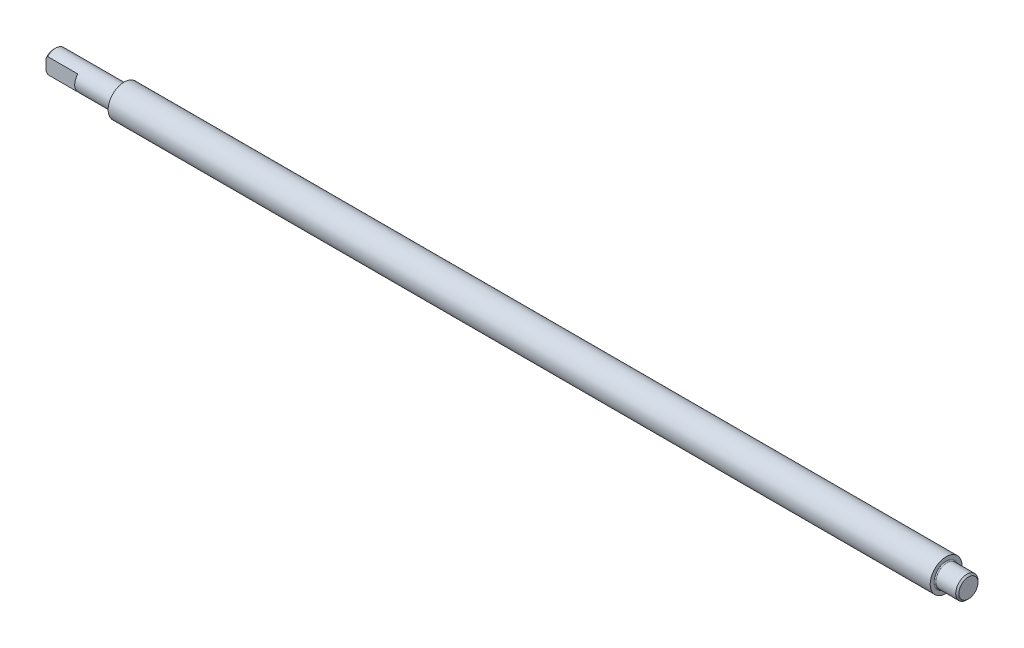
ISO-10303-21;
HEADER;
FILE_DESCRIPTION(('STEP AP214'),'2;1');
FILE_NAME('part.step','',(''),(''),'','','');
FILE_SCHEMA(('AUTOMOTIVE_DESIGN { 1 0 10303 214 1 1 1 1 }'));
ENDSEC;
DATA;
#1=APPLICATION_CONTEXT('core data for automotive mechanical design processes');
#2=APPLICATION_PROTOCOL_DEFINITION('international standard','automotive_design',2000,#1);
#3=PRODUCT_CONTEXT('',#1,'mechanical');
#4=PRODUCT('Part','Part','',(#3));
#5=PRODUCT_RELATED_PRODUCT_CATEGORY('part','',(#4));
#6=PRODUCT_DEFINITION_FORMATION('','',#4);
#7=PRODUCT_DEFINITION_CONTEXT('part definition',#1,'design');
#8=PRODUCT_DEFINITION('design','',#6,#7);
#9=PRODUCT_DEFINITION_SHAPE('','',#8);
#10=(LENGTH_UNIT() NAMED_UNIT(*) SI_UNIT(.MILLI.,.METRE.));
#11=(NAMED_UNIT(*) PLANE_ANGLE_UNIT() SI_UNIT($,.RADIAN.));
#12=(NAMED_UNIT(*) SI_UNIT($,.STERADIAN.) SOLID_ANGLE_UNIT());
#13=UNCERTAINTY_MEASURE_WITH_UNIT(LENGTH_MEASURE(1.E-05),#10,'distance_accuracy_value','');
#14=(GEOMETRIC_REPRESENTATION_CONTEXT(3) GLOBAL_UNCERTAINTY_ASSIGNED_CONTEXT((#13)) GLOBAL_UNIT_ASSIGNED_CONTEXT((#10,
#11,#12)) REPRESENTATION_CONTEXT('',''));
#15=CARTESIAN_POINT('',(0.,0.,0.));
#16=DIRECTION('',(0.,0.,1.));
#17=DIRECTION('',(1.,0.,0.));
#18=AXIS2_PLACEMENT_3D('',#15,#16,#17);
#19=CARTESIAN_POINT('',(287.,1.5,0.));
#20=DIRECTION('',(1.,0.,0.));
#21=DIRECTION('',(0.,0.,-1.));
#22=AXIS2_PLACEMENT_3D('',#19,#20,#21);
#23=PLANE('',#22);
#24=CARTESIAN_POINT('',(286.999999999921,0.,0.));
#25=DIRECTION('',(-1.,0.,0.));
#26=DIRECTION('',(0.,0.,1.));
#27=AXIS2_PLACEMENT_3D('',#24,#25,#26);
#28=CIRCLE('',#27,2.9999999999859);
#29=CARTESIAN_POINT('',(286.999999999921,0.,2.9999999999859));
#30=VERTEX_POINT('',#29);
#31=EDGE_CURVE('E167',#30,#30,#28,.T.);
#32=ORIENTED_EDGE('',*,*,#31,.F.);
#33=EDGE_LOOP('',(#32));
#34=FACE_BOUND('',#33,.T.);
#35=ADVANCED_FACE('F16',(#34),#23,.T.);
#36=CARTESIAN_POINT('',(0.,1.5,0.));
#37=DIRECTION('',(-1.,0.,0.));
#38=DIRECTION('',(0.,0.,1.));
#39=AXIS2_PLACEMENT_3D('',#36,#37,#38);
#40=PLANE('',#39);
#41=DIRECTION('',(0.,1.,0.));
#42=VECTOR('',#41,1.);
#43=CARTESIAN_POINT('',(0.,5.,2.5));
#44=LINE('',#43,#42);
#45=CARTESIAN_POINT('',(0.,-1.6583123951522,2.5));
#46=VERTEX_POINT('',#45);
#47=CARTESIAN_POINT('',(0.,1.6583123951522,2.5));
#48=VERTEX_POINT('',#47);
#49=EDGE_CURVE('E90',#46,#48,#44,.T.);
#50=ORIENTED_EDGE('',*,*,#49,.T.);
#51=CARTESIAN_POINT('',(0.,0.,0.));
#52=DIRECTION('',(1.,0.,0.));
#53=DIRECTION('',(0.,0.,-1.));
#54=AXIS2_PLACEMENT_3D('',#51,#52,#53);
#55=CIRCLE('',#54,2.9999999999859);
#56=EDGE_CURVE('E86',#46,#48,#55,.T.);
#57=ORIENTED_EDGE('',*,*,#56,.F.);
#58=EDGE_LOOP('',(#50,#57));
#59=FACE_BOUND('',#58,.T.);
#60=ADVANCED_FACE('F326',(#59),#40,.T.);
#61=CARTESIAN_POINT('',(286.49999999999,0.,0.));
#62=DIRECTION('',(-1.,0.,0.));
#63=DIRECTION('',(0.,0.,1.));
#64=AXIS2_PLACEMENT_3D('',#61,#62,#63);
#65=CONICAL_SURFACE('',#64,3.49999999991724,0.785398163397448);
#66=ORIENTED_EDGE('',*,*,#31,.T.);
#67=EDGE_LOOP('',(#66));
#68=FACE_BOUND('',#67,.T.);
#69=CARTESIAN_POINT('',(286.5,0.,0.));
#70=DIRECTION('',(1.,0.,0.));
#71=DIRECTION('',(0.,0.,-1.));
#72=AXIS2_PLACEMENT_3D('',#69,#70,#71);
#73=CIRCLE('',#72,3.49999999999999);
#74=CARTESIAN_POINT('',(286.5,0.,-3.49999999999999));
#75=VERTEX_POINT('',#74);
#76=EDGE_CURVE('E96',#75,#75,#73,.F.);
#77=ORIENTED_EDGE('',*,*,#76,.F.);
#78=EDGE_LOOP('',(#77));
#79=FACE_BOUND('',#78,.T.);
#80=ADVANCED_FACE('F320',(#68,#79),#65,.T.);
#81=CARTESIAN_POINT('',(10.,0.,0.));
#82=DIRECTION('',(1.,0.,0.));
#83=DIRECTION('',(0.,0.,-1.));
#84=AXIS2_PLACEMENT_3D('',#81,#82,#83);
#85=PLANE('',#84);
#86=DIRECTION('',(0.,1.,0.));
#87=VECTOR('',#86,1.);
#88=CARTESIAN_POINT('',(10.,5.,2.5));
#89=LINE('',#88,#87);
#90=CARTESIAN_POINT('',(10.,2.44948974278318,2.5));
#91=VERTEX_POINT('',#90);
#92=CARTESIAN_POINT('',(10.,-2.44948974278318,2.5));
#93=VERTEX_POINT('',#92);
#94=EDGE_CURVE('E93',#91,#93,#89,.F.);
#95=ORIENTED_EDGE('',*,*,#94,.T.);
#96=CARTESIAN_POINT('',(10.,0.,0.));
#97=DIRECTION('',(1.,0.,0.));
#98=DIRECTION('',(0.,0.,-1.));
#99=AXIS2_PLACEMENT_3D('',#96,#97,#98);
#100=CIRCLE('',#99,3.5);
#101=EDGE_CURVE('E95',#91,#93,#100,.T.);
#102=ORIENTED_EDGE('',*,*,#101,.F.);
#103=EDGE_LOOP('',(#95,#102));
#104=FACE_BOUND('',#103,.T.);
#105=ADVANCED_FACE('F314',(#104),#85,.F.);
#106=CARTESIAN_POINT('',(0.,5.,2.5));
#107=DIRECTION('',(0.,0.,-1.));
#108=DIRECTION('',(-1.,0.,0.));
#109=AXIS2_PLACEMENT_3D('',#106,#107,#108);
#110=PLANE('',#109);
#111=ORIENTED_EDGE('',*,*,#49,.F.);
#112=CARTESIAN_POINT('',(0.500000000006361,-2.44948974277212,2.5));
#113=CARTESIAN_POINT('',(0.455256526277442,-2.38554251125661,2.5));
#114=CARTESIAN_POINT('',(0.411096215273046,-2.32118009298458,2.5));
#115=CARTESIAN_POINT('',(0.32423414371624,-2.19154358811994,2.5));
#116=CARTESIAN_POINT('',(0.281531404903667,-2.12627015613063,2.5));
#117=CARTESIAN_POINT('',(0.197807919058859,-1.99463242409264,2.5));
#118=CARTESIAN_POINT('',(0.156787445390266,-1.92826794918757,2.5));
#119=CARTESIAN_POINT('',(0.0767732564911611,-1.79426868491229,2.5));
#120=CARTESIAN_POINT('',(0.037780952353961,-1.72663305452602,2.5));
#121=CARTESIAN_POINT('',(9.47806504979986E-12,-1.65831239516934,2.5));
#122=B_SPLINE_CURVE_WITH_KNOTS('',3,(#112,#113,#114,#115,#116,#117,#118,#119,#120,#121),
.UNSPECIFIED.,.F.,.F.,(4,2,2,2,4),(0.,0.234143987033252,0.468127606499763,0.70214909823705,
0.936331289702197),.UNSPECIFIED.);
#123=CARTESIAN_POINT('',(0.50000000000318,-2.44948974277765,2.5));
#124=VERTEX_POINT('',#123);
#125=EDGE_CURVE('E89',#124,#46,#122,.T.);
#126=ORIENTED_EDGE('',*,*,#125,.F.);
#127=DIRECTION('',(1.,0.,0.));
#128=VECTOR('',#127,1.);
#129=CARTESIAN_POINT('',(11.1,-2.44948974278318,2.5));
#130=LINE('',#129,#128);
#131=EDGE_CURVE('E76',#93,#124,#130,.F.);
#132=ORIENTED_EDGE('',*,*,#131,.F.);
#133=ORIENTED_EDGE('',*,*,#94,.F.);
#134=DIRECTION('',(1.,0.,0.));
#135=VECTOR('',#134,1.);
#136=CARTESIAN_POINT('',(11.1,2.44948974278318,2.5));
#137=LINE('',#136,#135);
#138=CARTESIAN_POINT('',(0.500000000004732,2.44948974277987,2.5));
#139=VERTEX_POINT('',#138);
#140=EDGE_CURVE('E74',#139,#91,#137,.T.);
#141=ORIENTED_EDGE('',*,*,#140,.F.);
#142=CARTESIAN_POINT('',(1.01378043260548E-11,1.65831239517054,2.5));
#143=CARTESIAN_POINT('',(0.0377809523547989,1.7266330545275,2.5));
#144=CARTESIAN_POINT('',(0.0767732564921859,1.79426868491405,2.5));
#145=CARTESIAN_POINT('',(0.156787445391678,1.92826794918989,2.5));
#146=CARTESIAN_POINT('',(0.197807919060472,1.99463242409523,2.5));
#147=CARTESIAN_POINT('',(0.28153140490569,2.12627015613376,2.5));
#148=CARTESIAN_POINT('',(0.324234143718474,2.19154358812333,2.5));
#149=CARTESIAN_POINT('',(0.411096215275709,2.32118009298849,2.5));
#150=CARTESIAN_POINT('',(0.455256526280323,2.38554251126078,2.5));
#151=CARTESIAN_POINT('',(0.500000000009463,2.44948974277656,2.5));
#152=B_SPLINE_CURVE_WITH_KNOTS('',3,(#142,#143,#144,#145,#146,#147,#148,#149,#150,#151),
.UNSPECIFIED.,.F.,.F.,(4,2,2,2,4),(0.,0.234182191466161,0.468203683204459,0.70218730267198,
0.936331289706245),.UNSPECIFIED.);
#153=EDGE_CURVE('E83',#48,#139,#152,.T.);
#154=ORIENTED_EDGE('',*,*,#153,.F.);
#155=EDGE_LOOP('',(#111,#126,#132,#133,#141,#154));
#156=FACE_BOUND('',#155,.T.);
#157=ADVANCED_FACE('F92',(#156),#110,.F.);
#158=CARTESIAN_POINT('',(0.499999999988177,0.,0.));
#159=DIRECTION('',(1.,0.,0.));
#160=DIRECTION('',(0.,0.,-1.));
#161=AXIS2_PLACEMENT_3D('',#158,#159,#160);
#162=CONICAL_SURFACE('',#161,3.49999999997408,0.785398163397448);
#163=ORIENTED_EDGE('',*,*,#125,.T.);
#164=ORIENTED_EDGE('',*,*,#56,.T.);
#165=ORIENTED_EDGE('',*,*,#153,.T.);
#166=CARTESIAN_POINT('',(0.5,0.,0.));
#167=DIRECTION('',(1.,0.,0.));
#168=DIRECTION('',(0.,0.,-1.));
#169=AXIS2_PLACEMENT_3D('',#166,#167,#168);
#170=CIRCLE('',#169,3.5);
#171=EDGE_CURVE('E68',#124,#139,#170,.T.);
#172=ORIENTED_EDGE('',*,*,#171,.F.);
#173=EDGE_LOOP('',(#163,#164,#165,#172));
#174=FACE_BOUND('',#173,.T.);
#175=ADVANCED_FACE('F84',(#174),#162,.T.);
#176=CARTESIAN_POINT('',(283.4,0.,0.));
#177=DIRECTION('',(1.,0.,0.));
#178=DIRECTION('',(0.,0.,-1.));
#179=AXIS2_PLACEMENT_3D('',#176,#177,#178);
#180=CYLINDRICAL_SURFACE('',#179,3.49999999999999);
#181=ORIENTED_EDGE('',*,*,#76,.T.);
#182=EDGE_LOOP('',(#181));
#183=FACE_BOUND('',#182,.T.);
#184=CARTESIAN_POINT('',(280.3,0.,0.));
#185=DIRECTION('',(-1.,0.,0.));
#186=DIRECTION('',(0.,0.,1.));
#187=AXIS2_PLACEMENT_3D('',#184,#185,#186);
#188=CIRCLE('',#187,3.49999999999999);
#189=CARTESIAN_POINT('',(280.3,0.,3.49999999999999));
#190=VERTEX_POINT('',#189);
#191=EDGE_CURVE('E79',#190,#190,#188,.F.);
#192=ORIENTED_EDGE('',*,*,#191,.T.);
#193=EDGE_LOOP('',(#192));
#194=FACE_BOUND('',#193,.T.);
#195=ADVANCED_FACE('F121',(#183,#194),#180,.T.);
#196=CARTESIAN_POINT('',(11.1,0.,0.));
#197=DIRECTION('',(1.,0.,0.));
#198=DIRECTION('',(0.,0.,-1.));
#199=AXIS2_PLACEMENT_3D('',#196,#197,#198);
#200=CYLINDRICAL_SURFACE('',#199,3.5);
#201=ORIENTED_EDGE('',*,*,#171,.T.);
#202=ORIENTED_EDGE('',*,*,#140,.T.);
#203=ORIENTED_EDGE('',*,*,#101,.T.);
#204=ORIENTED_EDGE('',*,*,#131,.T.);
#205=EDGE_LOOP('',(#201,#202,#203,#204));
#206=FACE_BOUND('',#205,.T.);
#207=CARTESIAN_POINT('',(21.7,0.,0.));
#208=DIRECTION('',(-1.,0.,0.));
#209=DIRECTION('',(0.,0.,1.));
#210=AXIS2_PLACEMENT_3D('',#207,#208,#209);
#211=CIRCLE('',#210,3.5);
#212=CARTESIAN_POINT('',(21.7,0.,3.5));
#213=VERTEX_POINT('',#212);
#214=EDGE_CURVE('E153',#213,#213,#211,.T.);
#215=ORIENTED_EDGE('',*,*,#214,.T.);
#216=EDGE_LOOP('',(#215));
#217=FACE_BOUND('',#216,.T.);
#218=ADVANCED_FACE('F70',(#206,#217),#200,.T.);
#219=CARTESIAN_POINT('',(280.3,0.,0.));
#220=DIRECTION('',(-1.,0.,0.));
#221=DIRECTION('',(0.,0.,1.));
#222=AXIS2_PLACEMENT_3D('',#219,#220,#221);
#223=TOROIDAL_SURFACE('',#222,3.79999999999989,0.299999999999898);
#224=ORIENTED_EDGE('',*,*,#191,.F.);
#225=EDGE_LOOP('',(#224));
#226=FACE_BOUND('',#225,.T.);
#227=CARTESIAN_POINT('',(280.,0.,0.));
#228=DIRECTION('',(1.,0.,0.));
#229=DIRECTION('',(0.,1.,0.));
#230=AXIS2_PLACEMENT_3D('',#227,#228,#229);
#231=CIRCLE('',#230,3.79999999999989);
#232=CARTESIAN_POINT('',(280.,0.,3.79999999999989));
#233=VERTEX_POINT('',#232);
#234=CARTESIAN_POINT('',(280.,3.79999999999997,0.));
#235=VERTEX_POINT('',#234);
#236=EDGE_CURVE('E161',#233,#235,#231,.F.);
#237=ORIENTED_EDGE('',*,*,#236,.F.);
#238=CARTESIAN_POINT('',(280.,0.,0.));
#239=DIRECTION('',(1.,0.,0.));
#240=DIRECTION('',(0.,0.,1.));
#241=AXIS2_PLACEMENT_3D('',#238,#239,#240);
#242=CIRCLE('',#241,3.79999999999989);
#243=CARTESIAN_POINT('',(280.,0.,-3.79999999999991));
#244=VERTEX_POINT('',#243);
#245=EDGE_CURVE('E148',#244,#233,#242,.F.);
#246=ORIENTED_EDGE('',*,*,#245,.F.);
#247=CARTESIAN_POINT('',(280.,0.,0.));
#248=DIRECTION('',(1.,0.,0.));
#249=DIRECTION('',(0.,0.,-1.));
#250=AXIS2_PLACEMENT_3D('',#247,#248,#249);
#251=CIRCLE('',#250,3.8);
#252=EDGE_CURVE('E195',#235,#244,#251,.F.);
#253=ORIENTED_EDGE('',*,*,#252,.F.);
#254=EDGE_LOOP('',(#237,#246,#253));
#255=FACE_BOUND('',#254,.T.);
#256=ADVANCED_FACE('F127',(#226,#255),#223,.F.);
#257=CARTESIAN_POINT('',(21.7,0.,0.));
#258=DIRECTION('',(-1.,0.,0.));
#259=DIRECTION('',(0.,0.,1.));
#260=AXIS2_PLACEMENT_3D('',#257,#258,#259);
#261=TOROIDAL_SURFACE('',#260,3.8,0.300000000000002);
#262=CARTESIAN_POINT('',(22.,0.,0.));
#263=DIRECTION('',(-1.,0.,0.));
#264=DIRECTION('',(0.,0.,-1.));
#265=AXIS2_PLACEMENT_3D('',#262,#263,#264);
#266=CIRCLE('',#265,3.8);
#267=CARTESIAN_POINT('',(22.,0.,3.8));
#268=VERTEX_POINT('',#267);
#269=CARTESIAN_POINT('',(22.,0.,-3.8));
#270=VERTEX_POINT('',#269);
#271=EDGE_CURVE('E36',#268,#270,#266,.F.);
#272=ORIENTED_EDGE('',*,*,#271,.F.);
#273=CARTESIAN_POINT('',(22.,0.,0.));
#274=DIRECTION('',(-1.,0.,0.));
#275=DIRECTION('',(0.,0.,1.));
#276=AXIS2_PLACEMENT_3D('',#273,#274,#275);
#277=CIRCLE('',#276,3.8);
#278=CARTESIAN_POINT('',(22.,3.8,0.));
#279=VERTEX_POINT('',#278);
#280=EDGE_CURVE('E174',#279,#268,#277,.F.);
#281=ORIENTED_EDGE('',*,*,#280,.F.);
#282=CARTESIAN_POINT('',(22.,0.,0.));
#283=DIRECTION('',(-1.,0.,0.));
#284=DIRECTION('',(0.,1.,0.));
#285=AXIS2_PLACEMENT_3D('',#282,#283,#284);
#286=CIRCLE('',#285,3.8);
#287=EDGE_CURVE('E185',#270,#279,#286,.F.);
#288=ORIENTED_EDGE('',*,*,#287,.F.);
#289=EDGE_LOOP('',(#272,#281,#288));
#290=FACE_BOUND('',#289,.T.);
#291=ORIENTED_EDGE('',*,*,#214,.F.);
#292=EDGE_LOOP('',(#291));
#293=FACE_BOUND('',#292,.T.);
#294=ADVANCED_FACE('F132',(#290,#293),#261,.F.);
#295=CARTESIAN_POINT('',(280.,2.5,0.));
#296=DIRECTION('',(1.,0.,0.));
#297=DIRECTION('',(0.,0.,-1.));
#298=AXIS2_PLACEMENT_3D('',#295,#296,#297);
#299=PLANE('',#298);
#300=ORIENTED_EDGE('',*,*,#252,.T.);
#301=ORIENTED_EDGE('',*,*,#245,.T.);
#302=ORIENTED_EDGE('',*,*,#236,.T.);
#303=EDGE_LOOP('',(#300,#301,#302));
#304=FACE_BOUND('',#303,.T.);
#305=CARTESIAN_POINT('',(280.,0.,0.));
#306=DIRECTION('',(1.,0.,0.));
#307=DIRECTION('',(0.,0.,-1.));
#308=AXIS2_PLACEMENT_3D('',#305,#306,#307);
#309=CIRCLE('',#308,5.);
#310=CARTESIAN_POINT('',(280.,0.,-5.));
#311=VERTEX_POINT('',#310);
#312=EDGE_CURVE('E27',#311,#311,#309,.F.);
#313=ORIENTED_EDGE('',*,*,#312,.F.);
#314=EDGE_LOOP('',(#313));
#315=FACE_BOUND('',#314,.T.);
#316=ADVANCED_FACE('F207',(#304,#315),#299,.T.);
#317=CARTESIAN_POINT('',(22.,2.5,0.));
#318=DIRECTION('',(-1.,0.,0.));
#319=DIRECTION('',(0.,0.,1.));
#320=AXIS2_PLACEMENT_3D('',#317,#318,#319);
#321=PLANE('',#320);
#322=ORIENTED_EDGE('',*,*,#280,.T.);
#323=ORIENTED_EDGE('',*,*,#271,.T.);
#324=ORIENTED_EDGE('',*,*,#287,.T.);
#325=EDGE_LOOP('',(#322,#323,#324));
#326=FACE_BOUND('',#325,.T.);
#327=CARTESIAN_POINT('',(22.,0.,0.));
#328=DIRECTION('',(1.,0.,0.));
#329=DIRECTION('',(0.,0.,-1.));
#330=AXIS2_PLACEMENT_3D('',#327,#328,#329);
#331=CIRCLE('',#330,5.);
#332=CARTESIAN_POINT('',(22.,0.,-5.));
#333=VERTEX_POINT('',#332);
#334=EDGE_CURVE('E10',#333,#333,#331,.T.);
#335=ORIENTED_EDGE('',*,*,#334,.F.);
#336=EDGE_LOOP('',(#335));
#337=FACE_BOUND('',#336,.T.);
#338=ADVANCED_FACE('F225',(#326,#337),#321,.T.);
#339=CARTESIAN_POINT('',(151.,0.,0.));
#340=DIRECTION('',(1.,0.,0.));
#341=DIRECTION('',(0.,0.,-1.));
#342=AXIS2_PLACEMENT_3D('',#339,#340,#341);
#343=CYLINDRICAL_SURFACE('',#342,5.);
#344=ORIENTED_EDGE('',*,*,#312,.T.);
#345=EDGE_LOOP('',(#344));
#346=FACE_BOUND('',#345,.T.);
#347=ORIENTED_EDGE('',*,*,#334,.T.);
#348=EDGE_LOOP('',(#347));
#349=FACE_BOUND('',#348,.T.);
#350=ADVANCED_FACE('F268',(#346,#349),#343,.T.);
#351=CLOSED_SHELL('',(#35,#60,#80,#105,#157,#175,#195,#218,#256,#294,#316,#338,#350));
#352=MANIFOLD_SOLID_BREP('B1',#351);
#353=ADVANCED_BREP_SHAPE_REPRESENTATION('',(#18,#352),#14);
#354=SHAPE_DEFINITION_REPRESENTATION(#9,#353);
ENDSEC;
END-ISO-10303-21;
